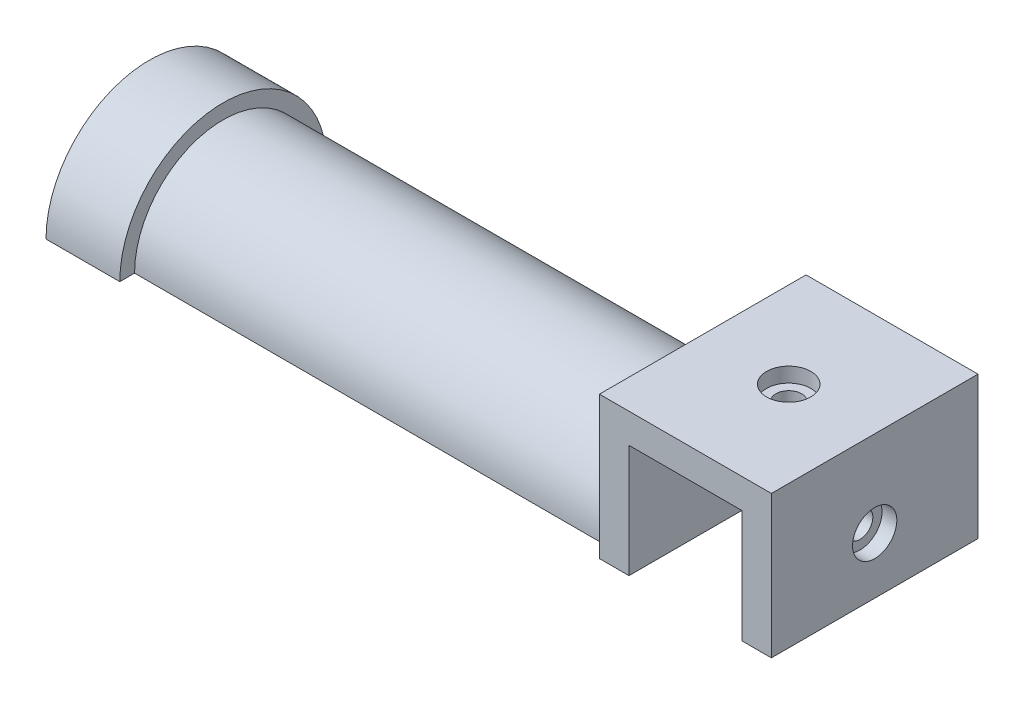
ISO-10303-21;
HEADER;
FILE_DESCRIPTION(('STEP AP214'),'2;1');
FILE_NAME('part.step','',(''),(''),'','','');
FILE_SCHEMA(('AUTOMOTIVE_DESIGN { 1 0 10303 214 1 1 1 1 }'));
ENDSEC;
DATA;
#1=APPLICATION_CONTEXT('core data for automotive mechanical design processes');
#2=APPLICATION_PROTOCOL_DEFINITION('international standard','automotive_design',2000,#1);
#3=PRODUCT_CONTEXT('',#1,'mechanical');
#4=PRODUCT('Part','Part','',(#3));
#5=PRODUCT_RELATED_PRODUCT_CATEGORY('part','',(#4));
#6=PRODUCT_DEFINITION_FORMATION('','',#4);
#7=PRODUCT_DEFINITION_CONTEXT('part definition',#1,'design');
#8=PRODUCT_DEFINITION('design','',#6,#7);
#9=PRODUCT_DEFINITION_SHAPE('','',#8);
#10=(LENGTH_UNIT() NAMED_UNIT(*) SI_UNIT(.MILLI.,.METRE.));
#11=(NAMED_UNIT(*) PLANE_ANGLE_UNIT() SI_UNIT($,.RADIAN.));
#12=(NAMED_UNIT(*) SI_UNIT($,.STERADIAN.) SOLID_ANGLE_UNIT());
#13=UNCERTAINTY_MEASURE_WITH_UNIT(LENGTH_MEASURE(1.E-05),#10,'distance_accuracy_value','');
#14=(GEOMETRIC_REPRESENTATION_CONTEXT(3) GLOBAL_UNCERTAINTY_ASSIGNED_CONTEXT((#13)) GLOBAL_UNIT_ASSIGNED_CONTEXT((#10,
#11,#12)) REPRESENTATION_CONTEXT('',''));
#15=CARTESIAN_POINT('',(0.,0.,0.));
#16=DIRECTION('',(0.,0.,1.));
#17=DIRECTION('',(1.,0.,0.));
#18=AXIS2_PLACEMENT_3D('',#15,#16,#17);
#19=CARTESIAN_POINT('',(-3.22121123700965,-1.98168795171109,28.));
#20=DIRECTION('',(0.,-1.,0.));
#21=DIRECTION('',(1.,0.,0.));
#22=AXIS2_PLACEMENT_3D('',#19,#20,#21);
#23=PLANE('',#22);
#24=DIRECTION('',(-1.,0.,0.));
#25=VECTOR('',#24,1.);
#26=CARTESIAN_POINT('',(-3.22121123700965,-1.98168795171109,0.));
#27=LINE('',#26,#25);
#28=CARTESIAN_POINT('',(18.3731769511203,-1.98168795171109,0.));
#29=VERTEX_POINT('',#28);
#30=CARTESIAN_POINT('',(-4.92682304887969,-1.98168795171109,0.));
#31=VERTEX_POINT('',#30);
#32=EDGE_CURVE('E156',#29,#31,#27,.T.);
#33=ORIENTED_EDGE('',*,*,#32,.T.);
#34=DIRECTION('',(0.,0.,-1.));
#35=VECTOR('',#34,1.);
#36=CARTESIAN_POINT('',(-4.92682304887969,-1.98168795171109,28.));
#37=LINE('',#36,#35);
#38=CARTESIAN_POINT('',(-4.92682304887969,-1.98168795171109,28.));
#39=VERTEX_POINT('',#38);
#40=EDGE_CURVE('E179',#39,#31,#37,.T.);
#41=ORIENTED_EDGE('',*,*,#40,.F.);
#42=DIRECTION('',(-1.,0.,0.));
#43=VECTOR('',#42,1.);
#44=CARTESIAN_POINT('',(-3.22121123700965,-1.98168795171109,28.));
#45=LINE('',#44,#43);
#46=CARTESIAN_POINT('',(18.3731769511203,-1.98168795171109,28.));
#47=VERTEX_POINT('',#46);
#48=EDGE_CURVE('E98',#47,#39,#45,.T.);
#49=ORIENTED_EDGE('',*,*,#48,.F.);
#50=DIRECTION('',(0.,0.,-1.));
#51=VECTOR('',#50,1.);
#52=CARTESIAN_POINT('',(18.3731769511203,-1.98168795171109,28.));
#53=LINE('',#52,#51);
#54=EDGE_CURVE('E51',#47,#29,#53,.T.);
#55=ORIENTED_EDGE('',*,*,#54,.T.);
#56=EDGE_LOOP('',(#33,#41,#49,#55));
#57=FACE_BOUND('',#56,.T.);
#58=CARTESIAN_POINT('',(6.72317695112031,-1.98168795171109,14.));
#59=DIRECTION('',(0.,1.,0.));
#60=DIRECTION('',(-1.,0.,0.));
#61=AXIS2_PLACEMENT_3D('',#58,#59,#60);
#62=CIRCLE('',#61,3.);
#63=CARTESIAN_POINT('',(3.72317695112031,-1.9816879517111,14.));
#64=VERTEX_POINT('',#63);
#65=EDGE_CURVE('E382',#64,#64,#62,.T.);
#66=ORIENTED_EDGE('',*,*,#65,.F.);
#67=EDGE_LOOP('',(#66));
#68=FACE_BOUND('',#67,.T.);
#69=ADVANCED_FACE('F16',(#57,#68),#23,.F.);
#70=CARTESIAN_POINT('',(-3.22121123700965,-21.2816879517111,28.));
#71=DIRECTION('',(0.,-1.,0.));
#72=DIRECTION('',(0.,0.,-1.));
#73=AXIS2_PLACEMENT_3D('',#70,#71,#72);
#74=PLANE('',#73);
#75=DIRECTION('',(1.,0.,0.));
#76=VECTOR('',#75,1.);
#77=CARTESIAN_POINT('',(-69.9268230488797,-21.2816879517111,2.));
#78=LINE('',#77,#76);
#79=CARTESIAN_POINT('',(-69.9268230488797,-21.2816879517111,2.));
#80=VERTEX_POINT('',#79);
#81=CARTESIAN_POINT('',(-4.92682304887969,-21.2816879517111,2.));
#82=VERTEX_POINT('',#81);
#83=EDGE_CURVE('E231',#80,#82,#78,.T.);
#84=ORIENTED_EDGE('',*,*,#83,.T.);
#85=DIRECTION('',(0.,0.,-1.));
#86=VECTOR('',#85,1.);
#87=CARTESIAN_POINT('',(-4.92682304887969,-21.2816879517111,28.));
#88=LINE('',#87,#86);
#89=CARTESIAN_POINT('',(-4.92682304887969,-21.2816879517111,0.));
#90=VERTEX_POINT('',#89);
#91=EDGE_CURVE('E220',#82,#90,#88,.T.);
#92=ORIENTED_EDGE('',*,*,#91,.T.);
#93=DIRECTION('',(-1.,0.,0.));
#94=VECTOR('',#93,1.);
#95=CARTESIAN_POINT('',(-3.22121123700965,-21.2816879517111,0.));
#96=LINE('',#95,#94);
#97=CARTESIAN_POINT('',(-0.926823048879686,-21.2816879517111,0.));
#98=VERTEX_POINT('',#97);
#99=EDGE_CURVE('E155',#98,#90,#96,.T.);
#100=ORIENTED_EDGE('',*,*,#99,.F.);
#101=DIRECTION('',(0.,0.,-1.));
#102=VECTOR('',#101,1.);
#103=CARTESIAN_POINT('',(-0.926823048879686,-21.2816879517111,28.));
#104=LINE('',#103,#102);
#105=CARTESIAN_POINT('',(-0.926823048879686,-21.2816879517111,28.));
#106=VERTEX_POINT('',#105);
#107=EDGE_CURVE('E146',#106,#98,#104,.T.);
#108=ORIENTED_EDGE('',*,*,#107,.F.);
#109=DIRECTION('',(-1.,0.,0.));
#110=VECTOR('',#109,1.);
#111=CARTESIAN_POINT('',(-3.22121123700965,-21.2816879517111,28.));
#112=LINE('',#111,#110);
#113=CARTESIAN_POINT('',(-4.92682304887969,-21.2816879517111,28.));
#114=VERTEX_POINT('',#113);
#115=EDGE_CURVE('E258',#106,#114,#112,.T.);
#116=ORIENTED_EDGE('',*,*,#115,.T.);
#117=CARTESIAN_POINT('',(-4.92682304887969,-21.2816879517111,26.));
#118=VERTEX_POINT('',#117);
#119=EDGE_CURVE('E200',#114,#118,#88,.T.);
#120=ORIENTED_EDGE('',*,*,#119,.T.);
#121=DIRECTION('',(1.,0.,0.));
#122=VECTOR('',#121,1.);
#123=CARTESIAN_POINT('',(-69.9268230488797,-21.2816879517111,26.));
#124=LINE('',#123,#122);
#125=CARTESIAN_POINT('',(-69.9268230488797,-21.2816879517111,26.));
#126=VERTEX_POINT('',#125);
#127=EDGE_CURVE('E235',#126,#118,#124,.T.);
#128=ORIENTED_EDGE('',*,*,#127,.F.);
#129=DIRECTION('',(0.,0.,-1.));
#130=VECTOR('',#129,1.);
#131=CARTESIAN_POINT('',(-69.9268230488797,-21.2816879517111,28.));
#132=LINE('',#131,#130);
#133=CARTESIAN_POINT('',(-69.9268230488797,-21.2816879517111,28.));
#134=VERTEX_POINT('',#133);
#135=EDGE_CURVE('E38',#134,#126,#132,.T.);
#136=ORIENTED_EDGE('',*,*,#135,.F.);
#137=DIRECTION('',(1.,0.,0.));
#138=VECTOR('',#137,1.);
#139=CARTESIAN_POINT('',(-79.9268230488797,-21.2816879517111,28.));
#140=LINE('',#139,#138);
#141=CARTESIAN_POINT('',(-79.9268230488797,-21.2816879517111,28.));
#142=VERTEX_POINT('',#141);
#143=EDGE_CURVE('E159',#142,#134,#140,.T.);
#144=ORIENTED_EDGE('',*,*,#143,.F.);
#145=DIRECTION('',(0.,0.,-1.));
#146=VECTOR('',#145,1.);
#147=CARTESIAN_POINT('',(-79.9268230488797,-21.2816879517111,28.));
#148=LINE('',#147,#146);
#149=CARTESIAN_POINT('',(-79.9268230488797,-21.2816879517111,0.));
#150=VERTEX_POINT('',#149);
#151=EDGE_CURVE('E239',#142,#150,#148,.T.);
#152=ORIENTED_EDGE('',*,*,#151,.T.);
#153=DIRECTION('',(1.,0.,0.));
#154=VECTOR('',#153,1.);
#155=CARTESIAN_POINT('',(-79.9268230488797,-21.2816879517111,0.));
#156=LINE('',#155,#154);
#157=CARTESIAN_POINT('',(-69.9268230488797,-21.2816879517111,0.));
#158=VERTEX_POINT('',#157);
#159=EDGE_CURVE('E247',#150,#158,#156,.T.);
#160=ORIENTED_EDGE('',*,*,#159,.T.);
#161=EDGE_CURVE('E224',#80,#158,#132,.T.);
#162=ORIENTED_EDGE('',*,*,#161,.F.);
#163=EDGE_LOOP('',(#84,#92,#100,#108,#116,#120,#128,#136,#144,#152,#160,#162));
#164=FACE_BOUND('',#163,.T.);
#165=ADVANCED_FACE('F372',(#164),#74,.T.);
#166=CARTESIAN_POINT('',(-0.92682304887969,-9.89760179072618,28.));
#167=DIRECTION('',(1.,0.,0.));
#168=DIRECTION('',(0.,1.,0.));
#169=AXIS2_PLACEMENT_3D('',#166,#167,#168);
#170=PLANE('',#169);
#171=DIRECTION('',(0.,-1.,0.));
#172=VECTOR('',#171,1.);
#173=CARTESIAN_POINT('',(-0.92682304887969,-9.89760179072618,0.));
#174=LINE('',#173,#172);
#175=CARTESIAN_POINT('',(-0.926823048879691,-5.9816879517111,0.));
#176=VERTEX_POINT('',#175);
#177=EDGE_CURVE('E150',#176,#98,#174,.T.);
#178=ORIENTED_EDGE('',*,*,#177,.F.);
#179=DIRECTION('',(0.,0.,-1.));
#180=VECTOR('',#179,1.);
#181=CARTESIAN_POINT('',(-0.926823048879691,-5.9816879517111,28.));
#182=LINE('',#181,#180);
#183=CARTESIAN_POINT('',(-0.926823048879691,-5.9816879517111,28.));
#184=VERTEX_POINT('',#183);
#185=EDGE_CURVE('E10',#184,#176,#182,.T.);
#186=ORIENTED_EDGE('',*,*,#185,.F.);
#187=DIRECTION('',(0.,-1.,0.));
#188=VECTOR('',#187,1.);
#189=CARTESIAN_POINT('',(-0.92682304887969,-9.89760179072618,28.));
#190=LINE('',#189,#188);
#191=EDGE_CURVE('E254',#184,#106,#190,.T.);
#192=ORIENTED_EDGE('',*,*,#191,.T.);
#193=ORIENTED_EDGE('',*,*,#107,.T.);
#194=EDGE_LOOP('',(#178,#186,#192,#193));
#195=FACE_BOUND('',#194,.T.);
#196=ADVANCED_FACE('F376',(#195),#170,.T.);
#197=CARTESIAN_POINT('',(7.82062595268285,-5.9816879517111,28.));
#198=DIRECTION('',(0.,1.,0.));
#199=DIRECTION('',(0.,0.,1.));
#200=AXIS2_PLACEMENT_3D('',#197,#198,#199);
#201=PLANE('',#200);
#202=CARTESIAN_POINT('',(6.72317695112031,-5.9816879517111,14.));
#203=DIRECTION('',(0.,1.,0.));
#204=DIRECTION('',(0.,0.,1.));
#205=AXIS2_PLACEMENT_3D('',#202,#203,#204);
#206=CIRCLE('',#205,1.75);
#207=CARTESIAN_POINT('',(6.72317695112031,-5.9816879517111,15.75));
#208=VERTEX_POINT('',#207);
#209=EDGE_CURVE('E19',#208,#208,#206,.T.);
#210=ORIENTED_EDGE('',*,*,#209,.T.);
#211=EDGE_LOOP('',(#210));
#212=FACE_BOUND('',#211,.T.);
#213=DIRECTION('',(1.,0.,0.));
#214=VECTOR('',#213,1.);
#215=CARTESIAN_POINT('',(7.82062595268285,-5.9816879517111,0.));
#216=LINE('',#215,#214);
#217=CARTESIAN_POINT('',(14.3731769511203,-5.9816879517111,0.));
#218=VERTEX_POINT('',#217);
#219=EDGE_CURVE('E154',#176,#218,#216,.T.);
#220=ORIENTED_EDGE('',*,*,#219,.T.);
#221=DIRECTION('',(0.,0.,-1.));
#222=VECTOR('',#221,1.);
#223=CARTESIAN_POINT('',(14.3731769511203,-5.9816879517111,28.));
#224=LINE('',#223,#222);
#225=CARTESIAN_POINT('',(14.3731769511203,-5.9816879517111,28.));
#226=VERTEX_POINT('',#225);
#227=EDGE_CURVE('E25',#226,#218,#224,.T.);
#228=ORIENTED_EDGE('',*,*,#227,.F.);
#229=DIRECTION('',(1.,0.,0.));
#230=VECTOR('',#229,1.);
#231=CARTESIAN_POINT('',(7.82062595268285,-5.9816879517111,28.));
#232=LINE('',#231,#230);
#233=EDGE_CURVE('E124',#184,#226,#232,.T.);
#234=ORIENTED_EDGE('',*,*,#233,.F.);
#235=ORIENTED_EDGE('',*,*,#185,.T.);
#236=EDGE_LOOP('',(#220,#228,#234,#235));
#237=FACE_BOUND('',#236,.T.);
#238=ADVANCED_FACE('F398',(#212,#237),#201,.F.);
#239=CARTESIAN_POINT('',(14.3731769511203,-9.49925894209414,28.));
#240=DIRECTION('',(1.,0.,0.));
#241=DIRECTION('',(0.,1.,0.));
#242=AXIS2_PLACEMENT_3D('',#239,#240,#241);
#243=PLANE('',#242);
#244=CARTESIAN_POINT('',(14.3731769511203,-13.6316879517111,14.));
#245=DIRECTION('',(1.,0.,0.));
#246=DIRECTION('',(0.,1.,0.));
#247=AXIS2_PLACEMENT_3D('',#244,#245,#246);
#248=CIRCLE('',#247,1.75);
#249=CARTESIAN_POINT('',(14.3731769511203,-11.8816879517111,14.));
#250=VERTEX_POINT('',#249);
#251=EDGE_CURVE('E188',#250,#250,#248,.T.);
#252=ORIENTED_EDGE('',*,*,#251,.T.);
#253=EDGE_LOOP('',(#252));
#254=FACE_BOUND('',#253,.T.);
#255=DIRECTION('',(0.,-1.,0.));
#256=VECTOR('',#255,1.);
#257=CARTESIAN_POINT('',(14.3731769511203,-9.49925894209414,0.));
#258=LINE('',#257,#256);
#259=CARTESIAN_POINT('',(14.3731769511203,-21.2816879517111,0.));
#260=VERTEX_POINT('',#259);
#261=EDGE_CURVE('E134',#218,#260,#258,.T.);
#262=ORIENTED_EDGE('',*,*,#261,.T.);
#263=DIRECTION('',(0.,0.,-1.));
#264=VECTOR('',#263,1.);
#265=CARTESIAN_POINT('',(14.3731769511203,-21.2816879517111,28.));
#266=LINE('',#265,#264);
#267=CARTESIAN_POINT('',(14.3731769511203,-21.2816879517111,28.));
#268=VERTEX_POINT('',#267);
#269=EDGE_CURVE('E131',#268,#260,#266,.T.);
#270=ORIENTED_EDGE('',*,*,#269,.F.);
#271=DIRECTION('',(0.,-1.,0.));
#272=VECTOR('',#271,1.);
#273=CARTESIAN_POINT('',(14.3731769511203,-9.49925894209414,28.));
#274=LINE('',#273,#272);
#275=EDGE_CURVE('E116',#226,#268,#274,.T.);
#276=ORIENTED_EDGE('',*,*,#275,.F.);
#277=ORIENTED_EDGE('',*,*,#227,.T.);
#278=EDGE_LOOP('',(#262,#270,#276,#277));
#279=FACE_BOUND('',#278,.T.);
#280=ADVANCED_FACE('F132',(#254,#279),#243,.F.);
#281=CARTESIAN_POINT('',(18.9285486977282,-21.2816879517111,28.));
#282=DIRECTION('',(0.,1.,0.));
#283=DIRECTION('',(0.,0.,1.));
#284=AXIS2_PLACEMENT_3D('',#281,#282,#283);
#285=PLANE('',#284);
#286=DIRECTION('',(1.,0.,0.));
#287=VECTOR('',#286,1.);
#288=CARTESIAN_POINT('',(18.9285486977282,-21.2816879517111,0.));
#289=LINE('',#288,#287);
#290=CARTESIAN_POINT('',(18.3731769511203,-21.2816879517111,0.));
#291=VERTEX_POINT('',#290);
#292=EDGE_CURVE('E170',#260,#291,#289,.T.);
#293=ORIENTED_EDGE('',*,*,#292,.T.);
#294=DIRECTION('',(0.,0.,-1.));
#295=VECTOR('',#294,1.);
#296=CARTESIAN_POINT('',(18.3731769511203,-21.2816879517111,28.));
#297=LINE('',#296,#295);
#298=CARTESIAN_POINT('',(18.3731769511203,-21.2816879517111,28.));
#299=VERTEX_POINT('',#298);
#300=EDGE_CURVE('E139',#299,#291,#297,.T.);
#301=ORIENTED_EDGE('',*,*,#300,.F.);
#302=DIRECTION('',(1.,0.,0.));
#303=VECTOR('',#302,1.);
#304=CARTESIAN_POINT('',(18.9285486977282,-21.2816879517111,28.));
#305=LINE('',#304,#303);
#306=EDGE_CURVE('E121',#268,#299,#305,.T.);
#307=ORIENTED_EDGE('',*,*,#306,.F.);
#308=ORIENTED_EDGE('',*,*,#269,.T.);
#309=EDGE_LOOP('',(#293,#301,#307,#308));
#310=FACE_BOUND('',#309,.T.);
#311=ADVANCED_FACE('F141',(#310),#285,.F.);
#312=CARTESIAN_POINT('',(18.3731769511203,-9.49925894209413,28.));
#313=DIRECTION('',(1.,0.,0.));
#314=DIRECTION('',(0.,1.,0.));
#315=AXIS2_PLACEMENT_3D('',#312,#313,#314);
#316=PLANE('',#315);
#317=CARTESIAN_POINT('',(18.3731769511203,-13.6316879517111,14.));
#318=DIRECTION('',(1.,0.,0.));
#319=DIRECTION('',(0.,1.,0.));
#320=AXIS2_PLACEMENT_3D('',#317,#318,#319);
#321=CIRCLE('',#320,3.);
#322=CARTESIAN_POINT('',(18.3731769511203,-10.6316879517111,14.));
#323=VERTEX_POINT('',#322);
#324=EDGE_CURVE('E211',#323,#323,#321,.T.);
#325=ORIENTED_EDGE('',*,*,#324,.F.);
#326=EDGE_LOOP('',(#325));
#327=FACE_BOUND('',#326,.T.);
#328=DIRECTION('',(0.,-1.,0.));
#329=VECTOR('',#328,1.);
#330=CARTESIAN_POINT('',(18.3731769511203,-9.49925894209413,0.));
#331=LINE('',#330,#329);
#332=EDGE_CURVE('E173',#29,#291,#331,.T.);
#333=ORIENTED_EDGE('',*,*,#332,.F.);
#334=ORIENTED_EDGE('',*,*,#54,.F.);
#335=DIRECTION('',(0.,-1.,0.));
#336=VECTOR('',#335,1.);
#337=CARTESIAN_POINT('',(18.3731769511203,-9.49925894209413,28.));
#338=LINE('',#337,#336);
#339=EDGE_CURVE('E143',#47,#299,#338,.T.);
#340=ORIENTED_EDGE('',*,*,#339,.T.);
#341=ORIENTED_EDGE('',*,*,#300,.T.);
#342=EDGE_LOOP('',(#333,#334,#340,#341));
#343=FACE_BOUND('',#342,.T.);
#344=ADVANCED_FACE('F406',(#327,#343),#316,.T.);
#345=CARTESIAN_POINT('',(-4.92682304887969,-9.89760179072618,28.));
#346=DIRECTION('',(1.,0.,0.));
#347=DIRECTION('',(0.,0.,-1.));
#348=AXIS2_PLACEMENT_3D('',#345,#346,#347);
#349=PLANE('',#348);
#350=DIRECTION('',(0.,-1.,0.));
#351=VECTOR('',#350,1.);
#352=CARTESIAN_POINT('',(-4.92682304887969,-9.89760179072618,0.));
#353=LINE('',#352,#351);
#354=EDGE_CURVE('E158',#31,#90,#353,.T.);
#355=ORIENTED_EDGE('',*,*,#354,.T.);
#356=ORIENTED_EDGE('',*,*,#91,.F.);
#357=CARTESIAN_POINT('',(-4.92682304887969,-21.2816879517111,14.));
#358=DIRECTION('',(-1.,0.,0.));
#359=DIRECTION('',(0.,0.,1.));
#360=AXIS2_PLACEMENT_3D('',#357,#358,#359);
#361=CIRCLE('',#360,12.);
#362=EDGE_CURVE('E191',#118,#82,#361,.T.);
#363=ORIENTED_EDGE('',*,*,#362,.F.);
#364=ORIENTED_EDGE('',*,*,#119,.F.);
#365=DIRECTION('',(0.,-1.,0.));
#366=VECTOR('',#365,1.);
#367=CARTESIAN_POINT('',(-4.92682304887969,-9.89760179072618,28.));
#368=LINE('',#367,#366);
#369=EDGE_CURVE('E261',#39,#114,#368,.T.);
#370=ORIENTED_EDGE('',*,*,#369,.F.);
#371=ORIENTED_EDGE('',*,*,#40,.T.);
#372=EDGE_LOOP('',(#355,#356,#363,#364,#370,#371));
#373=FACE_BOUND('',#372,.T.);
#374=ADVANCED_FACE('F280',(#373),#349,.F.);
#375=CARTESIAN_POINT('',(6.72317695112031,-11.6316879517111,28.));
#376=DIRECTION('',(0.,0.,1.));
#377=DIRECTION('',(1.,0.,0.));
#378=AXIS2_PLACEMENT_3D('',#375,#376,#377);
#379=PLANE('',#378);
#380=ORIENTED_EDGE('',*,*,#191,.F.);
#381=ORIENTED_EDGE('',*,*,#233,.T.);
#382=ORIENTED_EDGE('',*,*,#275,.T.);
#383=ORIENTED_EDGE('',*,*,#306,.T.);
#384=ORIENTED_EDGE('',*,*,#339,.F.);
#385=ORIENTED_EDGE('',*,*,#48,.T.);
#386=ORIENTED_EDGE('',*,*,#369,.T.);
#387=ORIENTED_EDGE('',*,*,#115,.F.);
#388=EDGE_LOOP('',(#380,#381,#382,#383,#384,#385,#386,#387));
#389=FACE_BOUND('',#388,.T.);
#390=ADVANCED_FACE('F119',(#389),#379,.T.);
#391=CARTESIAN_POINT('',(6.72317695112031,-11.6316879517111,0.));
#392=DIRECTION('',(0.,0.,1.));
#393=DIRECTION('',(1.,0.,0.));
#394=AXIS2_PLACEMENT_3D('',#391,#392,#393);
#395=PLANE('',#394);
#396=ORIENTED_EDGE('',*,*,#177,.T.);
#397=ORIENTED_EDGE('',*,*,#99,.T.);
#398=ORIENTED_EDGE('',*,*,#354,.F.);
#399=ORIENTED_EDGE('',*,*,#32,.F.);
#400=ORIENTED_EDGE('',*,*,#332,.T.);
#401=ORIENTED_EDGE('',*,*,#292,.F.);
#402=ORIENTED_EDGE('',*,*,#261,.F.);
#403=ORIENTED_EDGE('',*,*,#219,.F.);
#404=EDGE_LOOP('',(#396,#397,#398,#399,#400,#401,#402,#403));
#405=FACE_BOUND('',#404,.T.);
#406=ADVANCED_FACE('F279',(#405),#395,.F.);
#407=CARTESIAN_POINT('',(-79.9268230488797,-21.2816879517111,14.));
#408=DIRECTION('',(1.,0.,0.));
#409=DIRECTION('',(0.,0.,-1.));
#410=AXIS2_PLACEMENT_3D('',#407,#408,#409);
#411=CYLINDRICAL_SURFACE('',#410,14.);
#412=ORIENTED_EDGE('',*,*,#143,.T.);
#413=CARTESIAN_POINT('',(-69.9268230488797,-21.2816879517111,14.));
#414=DIRECTION('',(-1.,0.,0.));
#415=DIRECTION('',(0.,0.,1.));
#416=AXIS2_PLACEMENT_3D('',#413,#414,#415);
#417=CIRCLE('',#416,14.);
#418=EDGE_CURVE('E223',#134,#158,#417,.T.);
#419=ORIENTED_EDGE('',*,*,#418,.T.);
#420=ORIENTED_EDGE('',*,*,#159,.F.);
#421=CARTESIAN_POINT('',(-79.9268230488797,-21.2816879517111,14.));
#422=DIRECTION('',(-1.,0.,0.));
#423=DIRECTION('',(0.,0.,1.));
#424=AXIS2_PLACEMENT_3D('',#421,#422,#423);
#425=CIRCLE('',#424,14.);
#426=EDGE_CURVE('E243',#142,#150,#425,.T.);
#427=ORIENTED_EDGE('',*,*,#426,.F.);
#428=EDGE_LOOP('',(#412,#419,#420,#427));
#429=FACE_BOUND('',#428,.T.);
#430=ADVANCED_FACE('F296',(#429),#411,.T.);
#431=CARTESIAN_POINT('',(-79.9268230488797,-11.6316879517111,14.));
#432=DIRECTION('',(-1.,0.,0.));
#433=DIRECTION('',(0.,-1.,0.));
#434=AXIS2_PLACEMENT_3D('',#431,#432,#433);
#435=PLANE('',#434);
#436=ORIENTED_EDGE('',*,*,#426,.T.);
#437=ORIENTED_EDGE('',*,*,#151,.F.);
#438=EDGE_LOOP('',(#436,#437));
#439=FACE_BOUND('',#438,.T.);
#440=ADVANCED_FACE('F303',(#439),#435,.T.);
#441=CARTESIAN_POINT('',(-69.9268230488797,-21.2816879517111,14.));
#442=DIRECTION('',(1.,0.,0.));
#443=DIRECTION('',(0.,0.,-1.));
#444=AXIS2_PLACEMENT_3D('',#441,#442,#443);
#445=CYLINDRICAL_SURFACE('',#444,12.);
#446=ORIENTED_EDGE('',*,*,#362,.T.);
#447=ORIENTED_EDGE('',*,*,#83,.F.);
#448=CARTESIAN_POINT('',(-69.9268230488797,-21.2816879517111,14.));
#449=DIRECTION('',(-1.,0.,0.));
#450=DIRECTION('',(0.,0.,1.));
#451=AXIS2_PLACEMENT_3D('',#448,#449,#450);
#452=CIRCLE('',#451,12.);
#453=EDGE_CURVE('E218',#126,#80,#452,.T.);
#454=ORIENTED_EDGE('',*,*,#453,.F.);
#455=ORIENTED_EDGE('',*,*,#127,.T.);
#456=EDGE_LOOP('',(#446,#447,#454,#455));
#457=FACE_BOUND('',#456,.T.);
#458=ADVANCED_FACE('F310',(#457),#445,.T.);
#459=CARTESIAN_POINT('',(-69.9268230488797,-11.6316879517111,14.));
#460=DIRECTION('',(-1.,0.,0.));
#461=DIRECTION('',(0.,-1.,0.));
#462=AXIS2_PLACEMENT_3D('',#459,#460,#461);
#463=PLANE('',#462);
#464=ORIENTED_EDGE('',*,*,#453,.T.);
#465=ORIENTED_EDGE('',*,*,#161,.T.);
#466=ORIENTED_EDGE('',*,*,#418,.F.);
#467=ORIENTED_EDGE('',*,*,#135,.T.);
#468=EDGE_LOOP('',(#464,#465,#466,#467));
#469=FACE_BOUND('',#468,.T.);
#470=ADVANCED_FACE('F317',(#469),#463,.F.);
#471=CARTESIAN_POINT('',(13.3731769511203,-13.6316879517111,14.));
#472=DIRECTION('',(1.,0.,0.));
#473=DIRECTION('',(0.,1.,0.));
#474=AXIS2_PLACEMENT_3D('',#471,#472,#473);
#475=CYLINDRICAL_SURFACE('',#474,1.75);
#476=CARTESIAN_POINT('',(16.3731769511203,-13.6316879517111,14.));
#477=DIRECTION('',(1.,0.,0.));
#478=DIRECTION('',(0.,1.,0.));
#479=AXIS2_PLACEMENT_3D('',#476,#477,#478);
#480=CIRCLE('',#479,1.75);
#481=CARTESIAN_POINT('',(16.3731769511203,-11.8816879517111,14.));
#482=VERTEX_POINT('',#481);
#483=EDGE_CURVE('E204',#482,#482,#480,.T.);
#484=ORIENTED_EDGE('',*,*,#483,.T.);
#485=EDGE_LOOP('',(#484));
#486=FACE_BOUND('',#485,.T.);
#487=ORIENTED_EDGE('',*,*,#251,.F.);
#488=EDGE_LOOP('',(#487));
#489=FACE_BOUND('',#488,.T.);
#490=ADVANCED_FACE('F324',(#486,#489),#475,.F.);
#491=CARTESIAN_POINT('',(16.3731769511203,-13.6316879517111,14.));
#492=DIRECTION('',(1.,0.,0.));
#493=DIRECTION('',(0.,1.,0.));
#494=AXIS2_PLACEMENT_3D('',#491,#492,#493);
#495=CYLINDRICAL_SURFACE('',#494,3.);
#496=CARTESIAN_POINT('',(16.3731769511203,-13.6316879517111,14.));
#497=DIRECTION('',(1.,0.,0.));
#498=DIRECTION('',(0.,1.,0.));
#499=AXIS2_PLACEMENT_3D('',#496,#497,#498);
#500=CIRCLE('',#499,3.);
#501=CARTESIAN_POINT('',(16.3731769511203,-10.6316879517111,14.));
#502=VERTEX_POINT('',#501);
#503=EDGE_CURVE('E192',#502,#502,#500,.T.);
#504=ORIENTED_EDGE('',*,*,#503,.F.);
#505=EDGE_LOOP('',(#504));
#506=FACE_BOUND('',#505,.T.);
#507=ORIENTED_EDGE('',*,*,#324,.T.);
#508=EDGE_LOOP('',(#507));
#509=FACE_BOUND('',#508,.T.);
#510=ADVANCED_FACE('F329',(#506,#509),#495,.F.);
#511=CARTESIAN_POINT('',(16.3731769511203,-11.6316879517111,14.));
#512=DIRECTION('',(1.,0.,0.));
#513=DIRECTION('',(0.,1.,0.));
#514=AXIS2_PLACEMENT_3D('',#511,#512,#513);
#515=PLANE('',#514);
#516=ORIENTED_EDGE('',*,*,#483,.F.);
#517=EDGE_LOOP('',(#516));
#518=FACE_BOUND('',#517,.T.);
#519=ORIENTED_EDGE('',*,*,#503,.T.);
#520=EDGE_LOOP('',(#519));
#521=FACE_BOUND('',#520,.T.);
#522=ADVANCED_FACE('F336',(#518,#521),#515,.T.);
#523=CARTESIAN_POINT('',(6.72317695112031,-6.9816879517111,14.));
#524=DIRECTION('',(0.,1.,0.));
#525=DIRECTION('',(-1.,0.,0.));
#526=AXIS2_PLACEMENT_3D('',#523,#524,#525);
#527=CYLINDRICAL_SURFACE('',#526,1.75);
#528=CARTESIAN_POINT('',(6.72317695112031,-3.98168795171109,14.));
#529=DIRECTION('',(0.,1.,0.));
#530=DIRECTION('',(-1.,0.,0.));
#531=AXIS2_PLACEMENT_3D('',#528,#529,#530);
#532=CIRCLE('',#531,1.75);
#533=CARTESIAN_POINT('',(4.97317695112031,-3.98168795171109,14.));
#534=VERTEX_POINT('',#533);
#535=EDGE_CURVE('E384',#534,#534,#532,.T.);
#536=ORIENTED_EDGE('',*,*,#535,.T.);
#537=EDGE_LOOP('',(#536));
#538=FACE_BOUND('',#537,.T.);
#539=ORIENTED_EDGE('',*,*,#209,.F.);
#540=EDGE_LOOP('',(#539));
#541=FACE_BOUND('',#540,.T.);
#542=ADVANCED_FACE('F343',(#538,#541),#527,.F.);
#543=CARTESIAN_POINT('',(6.72317695112031,-3.98168795171109,14.));
#544=DIRECTION('',(0.,1.,0.));
#545=DIRECTION('',(-1.,0.,0.));
#546=AXIS2_PLACEMENT_3D('',#543,#544,#545);
#547=CYLINDRICAL_SURFACE('',#546,3.);
#548=CARTESIAN_POINT('',(6.72317695112031,-3.98168795171109,14.));
#549=DIRECTION('',(0.,1.,0.));
#550=DIRECTION('',(-1.,0.,0.));
#551=AXIS2_PLACEMENT_3D('',#548,#549,#550);
#552=CIRCLE('',#551,3.);
#553=CARTESIAN_POINT('',(3.72317695112031,-3.98168795171109,14.));
#554=VERTEX_POINT('',#553);
#555=EDGE_CURVE('E388',#554,#554,#552,.T.);
#556=ORIENTED_EDGE('',*,*,#555,.F.);
#557=EDGE_LOOP('',(#556));
#558=FACE_BOUND('',#557,.T.);
#559=ORIENTED_EDGE('',*,*,#65,.T.);
#560=EDGE_LOOP('',(#559));
#561=FACE_BOUND('',#560,.T.);
#562=ADVANCED_FACE('F351',(#558,#561),#547,.F.);
#563=CARTESIAN_POINT('',(6.72317695112031,-3.98168795171109,14.));
#564=DIRECTION('',(0.,1.,0.));
#565=DIRECTION('',(-1.,0.,0.));
#566=AXIS2_PLACEMENT_3D('',#563,#564,#565);
#567=PLANE('',#566);
#568=ORIENTED_EDGE('',*,*,#535,.F.);
#569=EDGE_LOOP('',(#568));
#570=FACE_BOUND('',#569,.T.);
#571=ORIENTED_EDGE('',*,*,#555,.T.);
#572=EDGE_LOOP('',(#571));
#573=FACE_BOUND('',#572,.T.);
#574=ADVANCED_FACE('F359',(#570,#573),#567,.T.);
#575=CLOSED_SHELL('',(#69,#165,#196,#238,#280,#311,#344,#374,#390,#406,#430,#440,#458,#470,#490,
#510,#522,#542,#562,#574));
#576=MANIFOLD_SOLID_BREP('B1',#575);
#577=ADVANCED_BREP_SHAPE_REPRESENTATION('',(#18,#576),#14);
#578=SHAPE_DEFINITION_REPRESENTATION(#9,#577);
ENDSEC;
END-ISO-10303-21;
